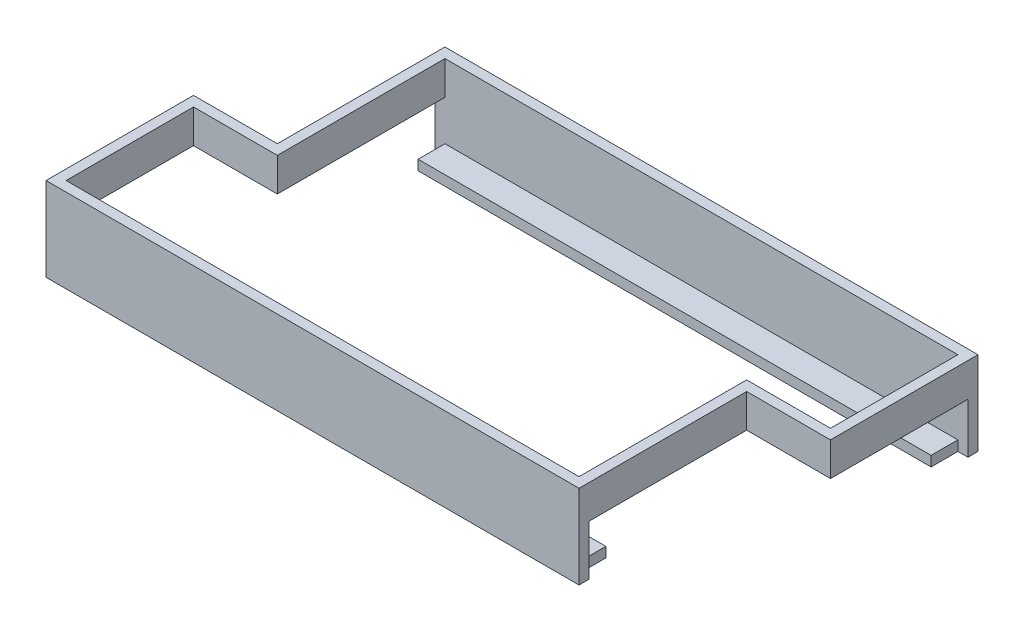
ISO-10303-21;
HEADER;
FILE_DESCRIPTION(('STEP AP214'),'2;1');
FILE_NAME('part.step','',(''),(''),'','','');
FILE_SCHEMA(('AUTOMOTIVE_DESIGN { 1 0 10303 214 1 1 1 1 }'));
ENDSEC;
DATA;
#1=APPLICATION_CONTEXT('core data for automotive mechanical design processes');
#2=APPLICATION_PROTOCOL_DEFINITION('international standard','automotive_design',2000,#1);
#3=PRODUCT_CONTEXT('',#1,'mechanical');
#4=PRODUCT('Part','Part','',(#3));
#5=PRODUCT_RELATED_PRODUCT_CATEGORY('part','',(#4));
#6=PRODUCT_DEFINITION_FORMATION('','',#4);
#7=PRODUCT_DEFINITION_CONTEXT('part definition',#1,'design');
#8=PRODUCT_DEFINITION('design','',#6,#7);
#9=PRODUCT_DEFINITION_SHAPE('','',#8);
#10=(LENGTH_UNIT() NAMED_UNIT(*) SI_UNIT(.MILLI.,.METRE.));
#11=(NAMED_UNIT(*) PLANE_ANGLE_UNIT() SI_UNIT($,.RADIAN.));
#12=(NAMED_UNIT(*) SI_UNIT($,.STERADIAN.) SOLID_ANGLE_UNIT());
#13=UNCERTAINTY_MEASURE_WITH_UNIT(LENGTH_MEASURE(1.E-05),#10,'distance_accuracy_value','');
#14=(GEOMETRIC_REPRESENTATION_CONTEXT(3) GLOBAL_UNCERTAINTY_ASSIGNED_CONTEXT((#13)) GLOBAL_UNIT_ASSIGNED_CONTEXT((#10,
#11,#12)) REPRESENTATION_CONTEXT('',''));
#15=CARTESIAN_POINT('',(0.,0.,0.));
#16=DIRECTION('',(0.,0.,1.));
#17=DIRECTION('',(1.,0.,0.));
#18=AXIS2_PLACEMENT_3D('',#15,#16,#17);
#19=CARTESIAN_POINT('',(92.,3.,-3.00000000000001));
#20=DIRECTION('',(-1.,0.,0.));
#21=DIRECTION('',(0.,0.,1.));
#22=AXIS2_PLACEMENT_3D('',#19,#20,#21);
#23=PLANE('',#22);
#24=DIRECTION('',(0.,-1.,0.));
#25=VECTOR('',#24,1.);
#26=CARTESIAN_POINT('',(92.,15.,-44.));
#27=LINE('',#26,#25);
#28=CARTESIAN_POINT('',(92.,15.,-44.));
#29=VERTEX_POINT('',#28);
#30=CARTESIAN_POINT('',(92.,0.,-44.));
#31=VERTEX_POINT('',#30);
#32=EDGE_CURVE('E281',#29,#31,#27,.T.);
#33=ORIENTED_EDGE('',*,*,#32,.T.);
#34=DIRECTION('',(0.,0.,-1.));
#35=VECTOR('',#34,1.);
#36=CARTESIAN_POINT('',(92.,0.,-3.00000000000001));
#37=LINE('',#36,#35);
#38=CARTESIAN_POINT('',(92.,0.,-47.));
#39=VERTEX_POINT('',#38);
#40=EDGE_CURVE('E404',#31,#39,#37,.T.);
#41=ORIENTED_EDGE('',*,*,#40,.T.);
#42=DIRECTION('',(0.,-1.,0.));
#43=VECTOR('',#42,1.);
#44=CARTESIAN_POINT('',(92.,3.,-47.));
#45=LINE('',#44,#43);
#46=CARTESIAN_POINT('',(92.,25.,-47.));
#47=VERTEX_POINT('',#46);
#48=EDGE_CURVE('E48',#47,#39,#45,.T.);
#49=ORIENTED_EDGE('',*,*,#48,.F.);
#50=DIRECTION('',(0.,0.,-1.));
#51=VECTOR('',#50,1.);
#52=CARTESIAN_POINT('',(92.,25.,-3.00000000000001));
#53=LINE('',#52,#51);
#54=CARTESIAN_POINT('',(92.,25.,-3.00000000000001));
#55=VERTEX_POINT('',#54);
#56=EDGE_CURVE('E383',#55,#47,#53,.T.);
#57=ORIENTED_EDGE('',*,*,#56,.F.);
#58=DIRECTION('',(0.,-1.,0.));
#59=VECTOR('',#58,1.);
#60=CARTESIAN_POINT('',(92.,3.,-3.00000000000001));
#61=LINE('',#60,#59);
#62=CARTESIAN_POINT('',(92.,15.,-3.00000000000002));
#63=VERTEX_POINT('',#62);
#64=EDGE_CURVE('E418',#55,#63,#61,.T.);
#65=ORIENTED_EDGE('',*,*,#64,.T.);
#66=DIRECTION('',(0.,0.,1.));
#67=VECTOR('',#66,1.);
#68=CARTESIAN_POINT('',(92.,15.,-44.));
#69=LINE('',#68,#67);
#70=EDGE_CURVE('E290',#29,#63,#69,.T.);
#71=ORIENTED_EDGE('',*,*,#70,.F.);
#72=EDGE_LOOP('',(#33,#41,#49,#57,#65,#71));
#73=FACE_BOUND('',#72,.T.);
#74=ADVANCED_FACE('F41',(#73),#23,.F.);
#75=CARTESIAN_POINT('',(-67.,3.,-47.));
#76=DIRECTION('',(1.,0.,0.));
#77=DIRECTION('',(0.,0.,-1.));
#78=AXIS2_PLACEMENT_3D('',#75,#76,#77);
#79=PLANE('',#78);
#80=DIRECTION('',(0.,-1.,0.));
#81=VECTOR('',#80,1.);
#82=CARTESIAN_POINT('',(-67.,3.,-44.));
#83=LINE('',#82,#81);
#84=CARTESIAN_POINT('',(-67.,15.,-44.));
#85=VERTEX_POINT('',#84);
#86=CARTESIAN_POINT('',(-67.,0.,-44.));
#87=VERTEX_POINT('',#86);
#88=EDGE_CURVE('E311',#85,#87,#83,.T.);
#89=ORIENTED_EDGE('',*,*,#88,.F.);
#90=DIRECTION('',(0.,0.,1.));
#91=VECTOR('',#90,1.);
#92=CARTESIAN_POINT('',(-67.,15.,-47.));
#93=LINE('',#92,#91);
#94=CARTESIAN_POINT('',(-67.,15.,3.00000000000001));
#95=VERTEX_POINT('',#94);
#96=EDGE_CURVE('E336',#85,#95,#93,.T.);
#97=ORIENTED_EDGE('',*,*,#96,.T.);
#98=DIRECTION('',(0.,-1.,0.));
#99=VECTOR('',#98,1.);
#100=CARTESIAN_POINT('',(-67.,3.,3.00000000000001));
#101=LINE('',#100,#99);
#102=CARTESIAN_POINT('',(-67.,25.,3.00000000000001));
#103=VERTEX_POINT('',#102);
#104=EDGE_CURVE('E433',#103,#95,#101,.T.);
#105=ORIENTED_EDGE('',*,*,#104,.F.);
#106=DIRECTION('',(0.,0.,1.));
#107=VECTOR('',#106,1.);
#108=CARTESIAN_POINT('',(-67.,25.,-47.));
#109=LINE('',#108,#107);
#110=CARTESIAN_POINT('',(-67.,25.,-47.));
#111=VERTEX_POINT('',#110);
#112=EDGE_CURVE('E389',#111,#103,#109,.T.);
#113=ORIENTED_EDGE('',*,*,#112,.F.);
#114=DIRECTION('',(0.,-1.,0.));
#115=VECTOR('',#114,1.);
#116=CARTESIAN_POINT('',(-67.,3.,-47.));
#117=LINE('',#116,#115);
#118=CARTESIAN_POINT('',(-67.,0.,-47.));
#119=VERTEX_POINT('',#118);
#120=EDGE_CURVE('E436',#111,#119,#117,.T.);
#121=ORIENTED_EDGE('',*,*,#120,.T.);
#122=DIRECTION('',(0.,0.,1.));
#123=VECTOR('',#122,1.);
#124=CARTESIAN_POINT('',(-67.,0.,-47.));
#125=LINE('',#124,#123);
#126=EDGE_CURVE('E408',#119,#87,#125,.T.);
#127=ORIENTED_EDGE('',*,*,#126,.T.);
#128=EDGE_LOOP('',(#89,#97,#105,#113,#121,#127));
#129=FACE_BOUND('',#128,.T.);
#130=ADVANCED_FACE('F467',(#129),#79,.F.);
#131=CARTESIAN_POINT('',(0.,0.,0.));
#132=DIRECTION('',(0.,-1.,0.));
#133=DIRECTION('',(0.,0.,-1.));
#134=AXIS2_PLACEMENT_3D('',#131,#132,#133);
#135=PLANE('',#134);
#136=ORIENTED_EDGE('',*,*,#40,.F.);
#137=DIRECTION('',(-1.,0.,0.));
#138=VECTOR('',#137,1.);
#139=CARTESIAN_POINT('',(0.,0.,-44.));
#140=LINE('',#139,#138);
#141=CARTESIAN_POINT('',(88.9999999999999,0.,-44.));
#142=VERTEX_POINT('',#141);
#143=EDGE_CURVE('E309',#31,#142,#140,.T.);
#144=ORIENTED_EDGE('',*,*,#143,.T.);
#145=DIRECTION('',(0.,0.,1.));
#146=VECTOR('',#145,1.);
#147=CARTESIAN_POINT('',(88.9999999999999,0.,-44.));
#148=LINE('',#147,#146);
#149=CARTESIAN_POINT('',(89.,0.,-36.));
#150=VERTEX_POINT('',#149);
#151=EDGE_CURVE('E241',#142,#150,#148,.T.);
#152=ORIENTED_EDGE('',*,*,#151,.T.);
#153=DIRECTION('',(-1.,0.,0.));
#154=VECTOR('',#153,1.);
#155=CARTESIAN_POINT('',(-64.,0.,-36.));
#156=LINE('',#155,#154);
#157=CARTESIAN_POINT('',(-64.,0.,-36.));
#158=VERTEX_POINT('',#157);
#159=EDGE_CURVE('E228',#150,#158,#156,.T.);
#160=ORIENTED_EDGE('',*,*,#159,.T.);
#161=DIRECTION('',(0.,0.,-1.));
#162=VECTOR('',#161,1.);
#163=CARTESIAN_POINT('',(-64.,0.,-44.));
#164=LINE('',#163,#162);
#165=CARTESIAN_POINT('',(-64.,0.,-44.));
#166=VERTEX_POINT('',#165);
#167=EDGE_CURVE('E55',#158,#166,#164,.T.);
#168=ORIENTED_EDGE('',*,*,#167,.T.);
#169=EDGE_CURVE('E308',#166,#87,#140,.T.);
#170=ORIENTED_EDGE('',*,*,#169,.T.);
#171=ORIENTED_EDGE('',*,*,#126,.F.);
#172=DIRECTION('',(-1.,0.,0.));
#173=VECTOR('',#172,1.);
#174=CARTESIAN_POINT('',(-67.,0.,-47.));
#175=LINE('',#174,#173);
#176=EDGE_CURVE('E406',#39,#119,#175,.T.);
#177=ORIENTED_EDGE('',*,*,#176,.F.);
#178=EDGE_LOOP('',(#136,#144,#152,#160,#168,#170,#171,#177));
#179=FACE_BOUND('',#178,.T.);
#180=ADVANCED_FACE('F245',(#179),#135,.T.);
#181=CARTESIAN_POINT('',(-67.,3.,-47.));
#182=DIRECTION('',(0.,0.,1.));
#183=DIRECTION('',(1.,0.,0.));
#184=AXIS2_PLACEMENT_3D('',#181,#182,#183);
#185=PLANE('',#184);
#186=ORIENTED_EDGE('',*,*,#176,.T.);
#187=ORIENTED_EDGE('',*,*,#120,.F.);
#188=DIRECTION('',(-1.,0.,0.));
#189=VECTOR('',#188,1.);
#190=CARTESIAN_POINT('',(92.,25.,-47.));
#191=LINE('',#190,#189);
#192=EDGE_CURVE('E386',#47,#111,#191,.T.);
#193=ORIENTED_EDGE('',*,*,#192,.F.);
#194=ORIENTED_EDGE('',*,*,#48,.T.);
#195=EDGE_LOOP('',(#186,#187,#193,#194));
#196=FACE_BOUND('',#195,.T.);
#197=ADVANCED_FACE('F441',(#196),#185,.F.);
#198=CARTESIAN_POINT('',(-67.,3.,3.00000000000001));
#199=DIRECTION('',(0.,0.,1.));
#200=DIRECTION('',(1.,0.,0.));
#201=AXIS2_PLACEMENT_3D('',#198,#199,#200);
#202=PLANE('',#201);
#203=ORIENTED_EDGE('',*,*,#104,.T.);
#204=DIRECTION('',(-1.,0.,0.));
#205=VECTOR('',#204,1.);
#206=CARTESIAN_POINT('',(-67.,15.,3.00000000000001));
#207=LINE('',#206,#205);
#208=CARTESIAN_POINT('',(-92.,15.,3.00000000000001));
#209=VERTEX_POINT('',#208);
#210=EDGE_CURVE('E333',#95,#209,#207,.T.);
#211=ORIENTED_EDGE('',*,*,#210,.T.);
#212=DIRECTION('',(0.,-1.,0.));
#213=VECTOR('',#212,1.);
#214=CARTESIAN_POINT('',(-92.,3.,3.00000000000001));
#215=LINE('',#214,#213);
#216=CARTESIAN_POINT('',(-92.,25.,3.00000000000001));
#217=VERTEX_POINT('',#216);
#218=EDGE_CURVE('E430',#217,#209,#215,.T.);
#219=ORIENTED_EDGE('',*,*,#218,.F.);
#220=DIRECTION('',(-1.,0.,0.));
#221=VECTOR('',#220,1.);
#222=CARTESIAN_POINT('',(-67.,25.,3.00000000000001));
#223=LINE('',#222,#221);
#224=EDGE_CURVE('E392',#103,#217,#223,.T.);
#225=ORIENTED_EDGE('',*,*,#224,.F.);
#226=EDGE_LOOP('',(#203,#211,#219,#225));
#227=FACE_BOUND('',#226,.T.);
#228=ADVANCED_FACE('F471',(#227),#202,.F.);
#229=CARTESIAN_POINT('',(-92.,3.,3.00000000000001));
#230=DIRECTION('',(1.,0.,0.));
#231=DIRECTION('',(0.,0.,-1.));
#232=AXIS2_PLACEMENT_3D('',#229,#230,#231);
#233=PLANE('',#232);
#234=DIRECTION('',(0.,0.,1.));
#235=VECTOR('',#234,1.);
#236=CARTESIAN_POINT('',(-92.,15.,3.00000000000002));
#237=LINE('',#236,#235);
#238=CARTESIAN_POINT('',(-92.,15.,44.));
#239=VERTEX_POINT('',#238);
#240=EDGE_CURVE('E330',#209,#239,#237,.T.);
#241=ORIENTED_EDGE('',*,*,#240,.T.);
#242=DIRECTION('',(0.,-1.,0.));
#243=VECTOR('',#242,1.);
#244=CARTESIAN_POINT('',(-92.,2.99999999999999,44.));
#245=LINE('',#244,#243);
#246=CARTESIAN_POINT('',(-92.,0.,44.));
#247=VERTEX_POINT('',#246);
#248=EDGE_CURVE('E305',#239,#247,#245,.T.);
#249=ORIENTED_EDGE('',*,*,#248,.T.);
#250=DIRECTION('',(0.,0.,1.));
#251=VECTOR('',#250,1.);
#252=CARTESIAN_POINT('',(-92.,0.,3.00000000000001));
#253=LINE('',#252,#251);
#254=CARTESIAN_POINT('',(-92.,0.,47.));
#255=VERTEX_POINT('',#254);
#256=EDGE_CURVE('E411',#247,#255,#253,.T.);
#257=ORIENTED_EDGE('',*,*,#256,.T.);
#258=DIRECTION('',(0.,-1.,0.));
#259=VECTOR('',#258,1.);
#260=CARTESIAN_POINT('',(-92.,3.,47.));
#261=LINE('',#260,#259);
#262=CARTESIAN_POINT('',(-92.,25.,47.));
#263=VERTEX_POINT('',#262);
#264=EDGE_CURVE('E427',#263,#255,#261,.T.);
#265=ORIENTED_EDGE('',*,*,#264,.F.);
#266=DIRECTION('',(0.,0.,1.));
#267=VECTOR('',#266,1.);
#268=CARTESIAN_POINT('',(-92.,25.,3.00000000000001));
#269=LINE('',#268,#267);
#270=EDGE_CURVE('E395',#217,#263,#269,.T.);
#271=ORIENTED_EDGE('',*,*,#270,.F.);
#272=ORIENTED_EDGE('',*,*,#218,.T.);
#273=EDGE_LOOP('',(#241,#249,#257,#265,#271,#272));
#274=FACE_BOUND('',#273,.T.);
#275=ADVANCED_FACE('F473',(#274),#233,.F.);
#276=CARTESIAN_POINT('',(-67.,3.,47.));
#277=DIRECTION('',(0.,0.,-1.));
#278=DIRECTION('',(-1.,0.,0.));
#279=AXIS2_PLACEMENT_3D('',#276,#277,#278);
#280=PLANE('',#279);
#281=DIRECTION('',(1.,0.,0.));
#282=VECTOR('',#281,1.);
#283=CARTESIAN_POINT('',(-67.,0.,47.));
#284=LINE('',#283,#282);
#285=CARTESIAN_POINT('',(67.,0.,47.));
#286=VERTEX_POINT('',#285);
#287=EDGE_CURVE('E413',#255,#286,#284,.T.);
#288=ORIENTED_EDGE('',*,*,#287,.T.);
#289=DIRECTION('',(0.,-1.,0.));
#290=VECTOR('',#289,1.);
#291=CARTESIAN_POINT('',(67.,3.,47.));
#292=LINE('',#291,#290);
#293=CARTESIAN_POINT('',(67.,25.,47.));
#294=VERTEX_POINT('',#293);
#295=EDGE_CURVE('E424',#294,#286,#292,.T.);
#296=ORIENTED_EDGE('',*,*,#295,.F.);
#297=DIRECTION('',(1.,0.,0.));
#298=VECTOR('',#297,1.);
#299=CARTESIAN_POINT('',(-92.,25.,47.));
#300=LINE('',#299,#298);
#301=EDGE_CURVE('E398',#263,#294,#300,.T.);
#302=ORIENTED_EDGE('',*,*,#301,.F.);
#303=ORIENTED_EDGE('',*,*,#264,.T.);
#304=EDGE_LOOP('',(#288,#296,#302,#303));
#305=FACE_BOUND('',#304,.T.);
#306=ADVANCED_FACE('F476',(#305),#280,.F.);
#307=CARTESIAN_POINT('',(67.,3.,-3.00000000000001));
#308=DIRECTION('',(-1.,0.,0.));
#309=DIRECTION('',(0.,0.,1.));
#310=AXIS2_PLACEMENT_3D('',#307,#308,#309);
#311=PLANE('',#310);
#312=DIRECTION('',(0.,0.,-1.));
#313=VECTOR('',#312,1.);
#314=CARTESIAN_POINT('',(67.,0.,-3.00000000000001));
#315=LINE('',#314,#313);
#316=CARTESIAN_POINT('',(67.,0.,44.));
#317=VERTEX_POINT('',#316);
#318=EDGE_CURVE('E415',#286,#317,#315,.T.);
#319=ORIENTED_EDGE('',*,*,#318,.T.);
#320=DIRECTION('',(0.,1.,0.));
#321=VECTOR('',#320,1.);
#322=CARTESIAN_POINT('',(67.,2.99999999999998,44.));
#323=LINE('',#322,#321);
#324=CARTESIAN_POINT('',(66.9999999999999,15.,44.));
#325=VERTEX_POINT('',#324);
#326=EDGE_CURVE('E301',#317,#325,#323,.T.);
#327=ORIENTED_EDGE('',*,*,#326,.T.);
#328=DIRECTION('',(0.,0.,-1.));
#329=VECTOR('',#328,1.);
#330=CARTESIAN_POINT('',(67.,15.,-3.00000000000001));
#331=LINE('',#330,#329);
#332=CARTESIAN_POINT('',(67.,15.,-3.00000000000001));
#333=VERTEX_POINT('',#332);
#334=EDGE_CURVE('E327',#325,#333,#331,.T.);
#335=ORIENTED_EDGE('',*,*,#334,.T.);
#336=DIRECTION('',(0.,-1.,0.));
#337=VECTOR('',#336,1.);
#338=CARTESIAN_POINT('',(67.,3.,-3.00000000000001));
#339=LINE('',#338,#337);
#340=CARTESIAN_POINT('',(67.,25.,-3.00000000000001));
#341=VERTEX_POINT('',#340);
#342=EDGE_CURVE('E421',#341,#333,#339,.T.);
#343=ORIENTED_EDGE('',*,*,#342,.F.);
#344=DIRECTION('',(0.,0.,-1.));
#345=VECTOR('',#344,1.);
#346=CARTESIAN_POINT('',(67.,25.,47.));
#347=LINE('',#346,#345);
#348=EDGE_CURVE('E401',#294,#341,#347,.T.);
#349=ORIENTED_EDGE('',*,*,#348,.F.);
#350=ORIENTED_EDGE('',*,*,#295,.T.);
#351=EDGE_LOOP('',(#319,#327,#335,#343,#349,#350));
#352=FACE_BOUND('',#351,.T.);
#353=ADVANCED_FACE('F480',(#352),#311,.F.);
#354=CARTESIAN_POINT('',(92.,3.,-3.00000000000001));
#355=DIRECTION('',(0.,0.,-1.));
#356=DIRECTION('',(-1.,0.,0.));
#357=AXIS2_PLACEMENT_3D('',#354,#355,#356);
#358=PLANE('',#357);
#359=ORIENTED_EDGE('',*,*,#342,.T.);
#360=DIRECTION('',(1.,0.,0.));
#361=VECTOR('',#360,1.);
#362=CARTESIAN_POINT('',(92.,15.,-3.00000000000001));
#363=LINE('',#362,#361);
#364=EDGE_CURVE('E324',#333,#63,#363,.T.);
#365=ORIENTED_EDGE('',*,*,#364,.T.);
#366=ORIENTED_EDGE('',*,*,#64,.F.);
#367=DIRECTION('',(1.,0.,0.));
#368=VECTOR('',#367,1.);
#369=CARTESIAN_POINT('',(67.,25.,-3.00000000000001));
#370=LINE('',#369,#368);
#371=EDGE_CURVE('E380',#341,#55,#370,.T.);
#372=ORIENTED_EDGE('',*,*,#371,.F.);
#373=EDGE_LOOP('',(#359,#365,#366,#372));
#374=FACE_BOUND('',#373,.T.);
#375=ADVANCED_FACE('F452',(#374),#358,.F.);
#376=DIRECTION('',(-1.,0.,0.));
#377=VECTOR('',#376,1.);
#378=CARTESIAN_POINT('',(0.,0.,44.));
#379=LINE('',#378,#377);
#380=CARTESIAN_POINT('',(63.9999999999999,0.,44.));
#381=VERTEX_POINT('',#380);
#382=EDGE_CURVE('E299',#317,#381,#379,.T.);
#383=ORIENTED_EDGE('',*,*,#382,.F.);
#384=ORIENTED_EDGE('',*,*,#318,.F.);
#385=ORIENTED_EDGE('',*,*,#287,.F.);
#386=ORIENTED_EDGE('',*,*,#256,.F.);
#387=CARTESIAN_POINT('',(-89.,0.,44.));
#388=VERTEX_POINT('',#387);
#389=EDGE_CURVE('E302',#388,#247,#379,.T.);
#390=ORIENTED_EDGE('',*,*,#389,.F.);
#391=DIRECTION('',(0.,0.,-1.));
#392=VECTOR('',#391,1.);
#393=CARTESIAN_POINT('',(-89.,0.,44.));
#394=LINE('',#393,#392);
#395=CARTESIAN_POINT('',(-89.,0.,36.));
#396=VERTEX_POINT('',#395);
#397=EDGE_CURVE('E240',#388,#396,#394,.T.);
#398=ORIENTED_EDGE('',*,*,#397,.T.);
#399=DIRECTION('',(1.,0.,0.));
#400=VECTOR('',#399,1.);
#401=CARTESIAN_POINT('',(-89.,0.,36.));
#402=LINE('',#401,#400);
#403=CARTESIAN_POINT('',(63.9999999999999,0.,36.));
#404=VERTEX_POINT('',#403);
#405=EDGE_CURVE('E274',#396,#404,#402,.T.);
#406=ORIENTED_EDGE('',*,*,#405,.T.);
#407=DIRECTION('',(0.,0.,1.));
#408=VECTOR('',#407,1.);
#409=CARTESIAN_POINT('',(63.9999999999999,0.,44.));
#410=LINE('',#409,#408);
#411=EDGE_CURVE('E264',#404,#381,#410,.T.);
#412=ORIENTED_EDGE('',*,*,#411,.T.);
#413=EDGE_LOOP('',(#383,#384,#385,#386,#390,#398,#406,#412));
#414=FACE_BOUND('',#413,.T.);
#415=ADVANCED_FACE('F483',(#414),#135,.T.);
#416=CARTESIAN_POINT('',(0.,25.,0.));
#417=DIRECTION('',(0.,1.,0.));
#418=DIRECTION('',(0.,0.,1.));
#419=AXIS2_PLACEMENT_3D('',#416,#417,#418);
#420=PLANE('',#419);
#421=ORIENTED_EDGE('',*,*,#371,.T.);
#422=ORIENTED_EDGE('',*,*,#56,.T.);
#423=ORIENTED_EDGE('',*,*,#192,.T.);
#424=ORIENTED_EDGE('',*,*,#112,.T.);
#425=ORIENTED_EDGE('',*,*,#224,.T.);
#426=ORIENTED_EDGE('',*,*,#270,.T.);
#427=ORIENTED_EDGE('',*,*,#301,.T.);
#428=ORIENTED_EDGE('',*,*,#348,.T.);
#429=EDGE_LOOP('',(#421,#422,#423,#424,#425,#426,#427,#428));
#430=FACE_BOUND('',#429,.T.);
#431=DIRECTION('',(0.,0.,1.));
#432=VECTOR('',#431,1.);
#433=CARTESIAN_POINT('',(-64.,25.,-44.));
#434=LINE('',#433,#432);
#435=CARTESIAN_POINT('',(-64.,25.,-44.));
#436=VERTEX_POINT('',#435);
#437=CARTESIAN_POINT('',(-64.,25.,6.00000000000001));
#438=VERTEX_POINT('',#437);
#439=EDGE_CURVE('E341',#436,#438,#434,.T.);
#440=ORIENTED_EDGE('',*,*,#439,.F.);
#441=DIRECTION('',(-1.,0.,0.));
#442=VECTOR('',#441,1.);
#443=CARTESIAN_POINT('',(89.,25.,-44.));
#444=LINE('',#443,#442);
#445=CARTESIAN_POINT('',(89.,25.,-44.));
#446=VERTEX_POINT('',#445);
#447=EDGE_CURVE('E339',#446,#436,#444,.T.);
#448=ORIENTED_EDGE('',*,*,#447,.F.);
#449=DIRECTION('',(0.,0.,-1.));
#450=VECTOR('',#449,1.);
#451=CARTESIAN_POINT('',(89.,25.,-6.00000000000001));
#452=LINE('',#451,#450);
#453=CARTESIAN_POINT('',(89.,25.,-6.00000000000001));
#454=VERTEX_POINT('',#453);
#455=EDGE_CURVE('E354',#454,#446,#452,.T.);
#456=ORIENTED_EDGE('',*,*,#455,.F.);
#457=DIRECTION('',(1.,0.,0.));
#458=VECTOR('',#457,1.);
#459=CARTESIAN_POINT('',(64.,25.,-6.00000000000001));
#460=LINE('',#459,#458);
#461=CARTESIAN_POINT('',(64.,25.,-6.00000000000001));
#462=VERTEX_POINT('',#461);
#463=EDGE_CURVE('E351',#462,#454,#460,.T.);
#464=ORIENTED_EDGE('',*,*,#463,.F.);
#465=DIRECTION('',(0.,0.,-1.));
#466=VECTOR('',#465,1.);
#467=CARTESIAN_POINT('',(64.,25.,44.));
#468=LINE('',#467,#466);
#469=CARTESIAN_POINT('',(64.,25.,44.));
#470=VERTEX_POINT('',#469);
#471=EDGE_CURVE('E349',#470,#462,#468,.T.);
#472=ORIENTED_EDGE('',*,*,#471,.F.);
#473=DIRECTION('',(1.,0.,0.));
#474=VECTOR('',#473,1.);
#475=CARTESIAN_POINT('',(-89.,25.,44.));
#476=LINE('',#475,#474);
#477=CARTESIAN_POINT('',(-89.,25.,44.));
#478=VERTEX_POINT('',#477);
#479=EDGE_CURVE('E347',#478,#470,#476,.T.);
#480=ORIENTED_EDGE('',*,*,#479,.F.);
#481=DIRECTION('',(0.,0.,1.));
#482=VECTOR('',#481,1.);
#483=CARTESIAN_POINT('',(-89.,25.,6.00000000000001));
#484=LINE('',#483,#482);
#485=CARTESIAN_POINT('',(-89.,25.,6.00000000000001));
#486=VERTEX_POINT('',#485);
#487=EDGE_CURVE('E345',#486,#478,#484,.T.);
#488=ORIENTED_EDGE('',*,*,#487,.F.);
#489=DIRECTION('',(-1.,0.,0.));
#490=VECTOR('',#489,1.);
#491=CARTESIAN_POINT('',(-64.,25.,6.00000000000001));
#492=LINE('',#491,#490);
#493=EDGE_CURVE('E343',#438,#486,#492,.T.);
#494=ORIENTED_EDGE('',*,*,#493,.F.);
#495=EDGE_LOOP('',(#440,#448,#456,#464,#472,#480,#488,#494));
#496=FACE_BOUND('',#495,.T.);
#497=ADVANCED_FACE('F446',(#430,#496),#420,.T.);
#498=CARTESIAN_POINT('',(89.,25.,-44.));
#499=DIRECTION('',(0.,0.,1.));
#500=DIRECTION('',(1.,0.,0.));
#501=AXIS2_PLACEMENT_3D('',#498,#499,#500);
#502=PLANE('',#501);
#503=DIRECTION('',(0.,-1.,0.));
#504=VECTOR('',#503,1.);
#505=CARTESIAN_POINT('',(-64.,3.,-44.));
#506=LINE('',#505,#504);
#507=CARTESIAN_POINT('',(-64.,3.,-44.));
#508=VERTEX_POINT('',#507);
#509=EDGE_CURVE('E238',#508,#166,#506,.T.);
#510=ORIENTED_EDGE('',*,*,#509,.F.);
#511=DIRECTION('',(1.,0.,0.));
#512=VECTOR('',#511,1.);
#513=CARTESIAN_POINT('',(-64.,3.,-44.));
#514=LINE('',#513,#512);
#515=CARTESIAN_POINT('',(88.9999999999999,3.,-44.));
#516=VERTEX_POINT('',#515);
#517=EDGE_CURVE('E250',#508,#516,#514,.T.);
#518=ORIENTED_EDGE('',*,*,#517,.T.);
#519=DIRECTION('',(0.,-1.,0.));
#520=VECTOR('',#519,1.);
#521=CARTESIAN_POINT('',(88.9999999999999,3.,-44.));
#522=LINE('',#521,#520);
#523=EDGE_CURVE('E463',#516,#142,#522,.T.);
#524=ORIENTED_EDGE('',*,*,#523,.T.);
#525=ORIENTED_EDGE('',*,*,#143,.F.);
#526=ORIENTED_EDGE('',*,*,#32,.F.);
#527=DIRECTION('',(1.,0.,0.));
#528=VECTOR('',#527,1.);
#529=CARTESIAN_POINT('',(-116.,15.,-44.));
#530=LINE('',#529,#528);
#531=CARTESIAN_POINT('',(88.9999999999999,15.,-44.));
#532=VERTEX_POINT('',#531);
#533=EDGE_CURVE('E292',#532,#29,#530,.T.);
#534=ORIENTED_EDGE('',*,*,#533,.F.);
#535=DIRECTION('',(0.,-1.,0.));
#536=VECTOR('',#535,1.);
#537=CARTESIAN_POINT('',(89.,25.,-44.));
#538=LINE('',#537,#536);
#539=EDGE_CURVE('E356',#446,#532,#538,.T.);
#540=ORIENTED_EDGE('',*,*,#539,.F.);
#541=ORIENTED_EDGE('',*,*,#447,.T.);
#542=DIRECTION('',(0.,-1.,0.));
#543=VECTOR('',#542,1.);
#544=CARTESIAN_POINT('',(-64.,25.,-44.));
#545=LINE('',#544,#543);
#546=CARTESIAN_POINT('',(-64.,15.,-44.));
#547=VERTEX_POINT('',#546);
#548=EDGE_CURVE('E377',#436,#547,#545,.T.);
#549=ORIENTED_EDGE('',*,*,#548,.T.);
#550=EDGE_CURVE('E294',#85,#547,#530,.T.);
#551=ORIENTED_EDGE('',*,*,#550,.F.);
#552=ORIENTED_EDGE('',*,*,#88,.T.);
#553=ORIENTED_EDGE('',*,*,#169,.F.);
#554=EDGE_LOOP('',(#510,#518,#524,#525,#526,#534,#540,#541,#549,#551,#552,#553));
#555=FACE_BOUND('',#554,.T.);
#556=ADVANCED_FACE('F461',(#555),#502,.T.);
#557=CARTESIAN_POINT('',(-64.,25.,-44.));
#558=DIRECTION('',(1.,0.,0.));
#559=DIRECTION('',(0.,0.,-1.));
#560=AXIS2_PLACEMENT_3D('',#557,#558,#559);
#561=PLANE('',#560);
#562=DIRECTION('',(0.,0.,1.));
#563=VECTOR('',#562,1.);
#564=CARTESIAN_POINT('',(-64.,15.,-44.));
#565=LINE('',#564,#563);
#566=CARTESIAN_POINT('',(-64.,15.,6.00000000000001));
#567=VERTEX_POINT('',#566);
#568=EDGE_CURVE('E322',#547,#567,#565,.T.);
#569=ORIENTED_EDGE('',*,*,#568,.F.);
#570=ORIENTED_EDGE('',*,*,#548,.F.);
#571=ORIENTED_EDGE('',*,*,#439,.T.);
#572=DIRECTION('',(0.,-1.,0.));
#573=VECTOR('',#572,1.);
#574=CARTESIAN_POINT('',(-64.,25.,6.00000000000001));
#575=LINE('',#574,#573);
#576=EDGE_CURVE('E374',#438,#567,#575,.T.);
#577=ORIENTED_EDGE('',*,*,#576,.T.);
#578=EDGE_LOOP('',(#569,#570,#571,#577));
#579=FACE_BOUND('',#578,.T.);
#580=ADVANCED_FACE('F528',(#579),#561,.T.);
#581=CARTESIAN_POINT('',(-64.,25.,6.00000000000001));
#582=DIRECTION('',(0.,0.,1.));
#583=DIRECTION('',(1.,0.,0.));
#584=AXIS2_PLACEMENT_3D('',#581,#582,#583);
#585=PLANE('',#584);
#586=DIRECTION('',(-1.,0.,0.));
#587=VECTOR('',#586,1.);
#588=CARTESIAN_POINT('',(-64.,15.,6.00000000000001));
#589=LINE('',#588,#587);
#590=CARTESIAN_POINT('',(-89.,15.,6.00000000000001));
#591=VERTEX_POINT('',#590);
#592=EDGE_CURVE('E320',#567,#591,#589,.T.);
#593=ORIENTED_EDGE('',*,*,#592,.F.);
#594=ORIENTED_EDGE('',*,*,#576,.F.);
#595=ORIENTED_EDGE('',*,*,#493,.T.);
#596=DIRECTION('',(0.,-1.,0.));
#597=VECTOR('',#596,1.);
#598=CARTESIAN_POINT('',(-89.,25.,6.00000000000001));
#599=LINE('',#598,#597);
#600=EDGE_CURVE('E371',#486,#591,#599,.T.);
#601=ORIENTED_EDGE('',*,*,#600,.T.);
#602=EDGE_LOOP('',(#593,#594,#595,#601));
#603=FACE_BOUND('',#602,.T.);
#604=ADVANCED_FACE('F531',(#603),#585,.T.);
#605=CARTESIAN_POINT('',(-89.,25.,6.00000000000001));
#606=DIRECTION('',(1.,0.,0.));
#607=DIRECTION('',(0.,0.,-1.));
#608=AXIS2_PLACEMENT_3D('',#605,#606,#607);
#609=PLANE('',#608);
#610=DIRECTION('',(0.,0.,1.));
#611=VECTOR('',#610,1.);
#612=CARTESIAN_POINT('',(-89.,15.,6.00000000000001));
#613=LINE('',#612,#611);
#614=CARTESIAN_POINT('',(-89.,15.,44.));
#615=VERTEX_POINT('',#614);
#616=EDGE_CURVE('E318',#591,#615,#613,.T.);
#617=ORIENTED_EDGE('',*,*,#616,.F.);
#618=ORIENTED_EDGE('',*,*,#600,.F.);
#619=ORIENTED_EDGE('',*,*,#487,.T.);
#620=DIRECTION('',(0.,-1.,0.));
#621=VECTOR('',#620,1.);
#622=CARTESIAN_POINT('',(-89.,25.,44.));
#623=LINE('',#622,#621);
#624=EDGE_CURVE('E368',#478,#615,#623,.T.);
#625=ORIENTED_EDGE('',*,*,#624,.T.);
#626=EDGE_LOOP('',(#617,#618,#619,#625));
#627=FACE_BOUND('',#626,.T.);
#628=ADVANCED_FACE('F505',(#627),#609,.T.);
#629=CARTESIAN_POINT('',(-89.,25.,44.));
#630=DIRECTION('',(0.,0.,-1.));
#631=DIRECTION('',(-1.,0.,0.));
#632=AXIS2_PLACEMENT_3D('',#629,#630,#631);
#633=PLANE('',#632);
#634=DIRECTION('',(0.,-1.,0.));
#635=VECTOR('',#634,1.);
#636=CARTESIAN_POINT('',(-89.,3.,44.));
#637=LINE('',#636,#635);
#638=CARTESIAN_POINT('',(-89.,3.,44.));
#639=VERTEX_POINT('',#638);
#640=EDGE_CURVE('E279',#639,#388,#637,.T.);
#641=ORIENTED_EDGE('',*,*,#640,.T.);
#642=ORIENTED_EDGE('',*,*,#389,.T.);
#643=ORIENTED_EDGE('',*,*,#248,.F.);
#644=DIRECTION('',(1.,0.,0.));
#645=VECTOR('',#644,1.);
#646=CARTESIAN_POINT('',(-116.,15.,44.));
#647=LINE('',#646,#645);
#648=EDGE_CURVE('E298',#239,#615,#647,.T.);
#649=ORIENTED_EDGE('',*,*,#648,.T.);
#650=ORIENTED_EDGE('',*,*,#624,.F.);
#651=ORIENTED_EDGE('',*,*,#479,.T.);
#652=DIRECTION('',(0.,-1.,0.));
#653=VECTOR('',#652,1.);
#654=CARTESIAN_POINT('',(64.,25.,44.));
#655=LINE('',#654,#653);
#656=CARTESIAN_POINT('',(63.9999999999999,15.,44.));
#657=VERTEX_POINT('',#656);
#658=EDGE_CURVE('E365',#470,#657,#655,.T.);
#659=ORIENTED_EDGE('',*,*,#658,.T.);
#660=EDGE_CURVE('E295',#657,#325,#647,.T.);
#661=ORIENTED_EDGE('',*,*,#660,.T.);
#662=ORIENTED_EDGE('',*,*,#326,.F.);
#663=ORIENTED_EDGE('',*,*,#382,.T.);
#664=DIRECTION('',(0.,-1.,0.));
#665=VECTOR('',#664,1.);
#666=CARTESIAN_POINT('',(63.9999999999999,3.,44.));
#667=LINE('',#666,#665);
#668=CARTESIAN_POINT('',(63.9999999999999,3.,44.));
#669=VERTEX_POINT('',#668);
#670=EDGE_CURVE('E282',#669,#381,#667,.T.);
#671=ORIENTED_EDGE('',*,*,#670,.F.);
#672=DIRECTION('',(-1.,0.,0.));
#673=VECTOR('',#672,1.);
#674=CARTESIAN_POINT('',(-89.,3.,44.));
#675=LINE('',#674,#673);
#676=EDGE_CURVE('E63',#669,#639,#675,.T.);
#677=ORIENTED_EDGE('',*,*,#676,.T.);
#678=EDGE_LOOP('',(#641,#642,#643,#649,#650,#651,#659,#661,#662,#663,#671,#677));
#679=FACE_BOUND('',#678,.T.);
#680=ADVANCED_FACE('F486',(#679),#633,.T.);
#681=CARTESIAN_POINT('',(64.,25.,44.));
#682=DIRECTION('',(-1.,0.,0.));
#683=DIRECTION('',(0.,0.,1.));
#684=AXIS2_PLACEMENT_3D('',#681,#682,#683);
#685=PLANE('',#684);
#686=DIRECTION('',(0.,0.,-1.));
#687=VECTOR('',#686,1.);
#688=CARTESIAN_POINT('',(64.,15.,44.));
#689=LINE('',#688,#687);
#690=CARTESIAN_POINT('',(64.,15.,-6.00000000000001));
#691=VERTEX_POINT('',#690);
#692=EDGE_CURVE('E316',#657,#691,#689,.T.);
#693=ORIENTED_EDGE('',*,*,#692,.F.);
#694=ORIENTED_EDGE('',*,*,#658,.F.);
#695=ORIENTED_EDGE('',*,*,#471,.T.);
#696=DIRECTION('',(0.,-1.,0.));
#697=VECTOR('',#696,1.);
#698=CARTESIAN_POINT('',(64.,25.,-6.00000000000001));
#699=LINE('',#698,#697);
#700=EDGE_CURVE('E362',#462,#691,#699,.T.);
#701=ORIENTED_EDGE('',*,*,#700,.T.);
#702=EDGE_LOOP('',(#693,#694,#695,#701));
#703=FACE_BOUND('',#702,.T.);
#704=ADVANCED_FACE('F515',(#703),#685,.T.);
#705=CARTESIAN_POINT('',(64.,25.,-6.00000000000001));
#706=DIRECTION('',(0.,0.,-1.));
#707=DIRECTION('',(-1.,0.,0.));
#708=AXIS2_PLACEMENT_3D('',#705,#706,#707);
#709=PLANE('',#708);
#710=DIRECTION('',(1.,0.,0.));
#711=VECTOR('',#710,1.);
#712=CARTESIAN_POINT('',(64.,15.,-6.00000000000001));
#713=LINE('',#712,#711);
#714=CARTESIAN_POINT('',(89.,15.,-6.00000000000001));
#715=VERTEX_POINT('',#714);
#716=EDGE_CURVE('E314',#691,#715,#713,.T.);
#717=ORIENTED_EDGE('',*,*,#716,.F.);
#718=ORIENTED_EDGE('',*,*,#700,.F.);
#719=ORIENTED_EDGE('',*,*,#463,.T.);
#720=DIRECTION('',(0.,-1.,0.));
#721=VECTOR('',#720,1.);
#722=CARTESIAN_POINT('',(89.,25.,-6.00000000000001));
#723=LINE('',#722,#721);
#724=EDGE_CURVE('E359',#454,#715,#723,.T.);
#725=ORIENTED_EDGE('',*,*,#724,.T.);
#726=EDGE_LOOP('',(#717,#718,#719,#725));
#727=FACE_BOUND('',#726,.T.);
#728=ADVANCED_FACE('F519',(#727),#709,.T.);
#729=CARTESIAN_POINT('',(89.,25.,-6.00000000000001));
#730=DIRECTION('',(-1.,0.,0.));
#731=DIRECTION('',(0.,0.,1.));
#732=AXIS2_PLACEMENT_3D('',#729,#730,#731);
#733=PLANE('',#732);
#734=DIRECTION('',(0.,0.,-1.));
#735=VECTOR('',#734,1.);
#736=CARTESIAN_POINT('',(89.,15.,-6.00000000000001));
#737=LINE('',#736,#735);
#738=EDGE_CURVE('E11',#715,#532,#737,.T.);
#739=ORIENTED_EDGE('',*,*,#738,.F.);
#740=ORIENTED_EDGE('',*,*,#724,.F.);
#741=ORIENTED_EDGE('',*,*,#455,.T.);
#742=ORIENTED_EDGE('',*,*,#539,.T.);
#743=EDGE_LOOP('',(#739,#740,#741,#742));
#744=FACE_BOUND('',#743,.T.);
#745=ADVANCED_FACE('F522',(#744),#733,.T.);
#746=CARTESIAN_POINT('',(-116.,15.,-44.));
#747=DIRECTION('',(0.,1.,0.));
#748=DIRECTION('',(0.,0.,1.));
#749=AXIS2_PLACEMENT_3D('',#746,#747,#748);
#750=PLANE('',#749);
#751=ORIENTED_EDGE('',*,*,#550,.T.);
#752=ORIENTED_EDGE('',*,*,#568,.T.);
#753=ORIENTED_EDGE('',*,*,#592,.T.);
#754=ORIENTED_EDGE('',*,*,#616,.T.);
#755=ORIENTED_EDGE('',*,*,#648,.F.);
#756=ORIENTED_EDGE('',*,*,#240,.F.);
#757=ORIENTED_EDGE('',*,*,#210,.F.);
#758=ORIENTED_EDGE('',*,*,#96,.F.);
#759=EDGE_LOOP('',(#751,#752,#753,#754,#755,#756,#757,#758));
#760=FACE_BOUND('',#759,.T.);
#761=ADVANCED_FACE('F532',(#760),#750,.F.);
#762=ORIENTED_EDGE('',*,*,#660,.F.);
#763=ORIENTED_EDGE('',*,*,#692,.T.);
#764=ORIENTED_EDGE('',*,*,#716,.T.);
#765=ORIENTED_EDGE('',*,*,#738,.T.);
#766=ORIENTED_EDGE('',*,*,#533,.T.);
#767=ORIENTED_EDGE('',*,*,#70,.T.);
#768=ORIENTED_EDGE('',*,*,#364,.F.);
#769=ORIENTED_EDGE('',*,*,#334,.F.);
#770=EDGE_LOOP('',(#762,#763,#764,#765,#766,#767,#768,#769));
#771=FACE_BOUND('',#770,.T.);
#772=ADVANCED_FACE('F456',(#771),#750,.F.);
#773=CARTESIAN_POINT('',(-89.,3.,44.));
#774=DIRECTION('',(-1.,0.,0.));
#775=DIRECTION('',(0.,0.,1.));
#776=AXIS2_PLACEMENT_3D('',#773,#774,#775);
#777=PLANE('',#776);
#778=ORIENTED_EDGE('',*,*,#397,.F.);
#779=ORIENTED_EDGE('',*,*,#640,.F.);
#780=DIRECTION('',(0.,0.,-1.));
#781=VECTOR('',#780,1.);
#782=CARTESIAN_POINT('',(-89.,3.,44.));
#783=LINE('',#782,#781);
#784=CARTESIAN_POINT('',(-89.,3.,36.));
#785=VERTEX_POINT('',#784);
#786=EDGE_CURVE('E260',#639,#785,#783,.T.);
#787=ORIENTED_EDGE('',*,*,#786,.T.);
#788=DIRECTION('',(0.,-1.,0.));
#789=VECTOR('',#788,1.);
#790=CARTESIAN_POINT('',(-89.,3.,36.));
#791=LINE('',#790,#789);
#792=EDGE_CURVE('E271',#785,#396,#791,.T.);
#793=ORIENTED_EDGE('',*,*,#792,.T.);
#794=EDGE_LOOP('',(#778,#779,#787,#793));
#795=FACE_BOUND('',#794,.T.);
#796=ADVANCED_FACE('F496',(#795),#777,.T.);
#797=CARTESIAN_POINT('',(63.9999999999999,3.,44.));
#798=DIRECTION('',(1.,0.,0.));
#799=DIRECTION('',(0.,0.,-1.));
#800=AXIS2_PLACEMENT_3D('',#797,#798,#799);
#801=PLANE('',#800);
#802=ORIENTED_EDGE('',*,*,#411,.F.);
#803=DIRECTION('',(0.,-1.,0.));
#804=VECTOR('',#803,1.);
#805=CARTESIAN_POINT('',(63.9999999999999,3.,36.));
#806=LINE('',#805,#804);
#807=CARTESIAN_POINT('',(63.9999999999999,3.,36.));
#808=VERTEX_POINT('',#807);
#809=EDGE_CURVE('E285',#808,#404,#806,.T.);
#810=ORIENTED_EDGE('',*,*,#809,.F.);
#811=DIRECTION('',(0.,0.,1.));
#812=VECTOR('',#811,1.);
#813=CARTESIAN_POINT('',(63.9999999999999,3.,44.));
#814=LINE('',#813,#812);
#815=EDGE_CURVE('E267',#808,#669,#814,.T.);
#816=ORIENTED_EDGE('',*,*,#815,.T.);
#817=ORIENTED_EDGE('',*,*,#670,.T.);
#818=EDGE_LOOP('',(#802,#810,#816,#817));
#819=FACE_BOUND('',#818,.T.);
#820=ADVANCED_FACE('F488',(#819),#801,.T.);
#821=CARTESIAN_POINT('',(-89.,3.,36.));
#822=DIRECTION('',(0.,0.,-1.));
#823=DIRECTION('',(-1.,0.,0.));
#824=AXIS2_PLACEMENT_3D('',#821,#822,#823);
#825=PLANE('',#824);
#826=ORIENTED_EDGE('',*,*,#405,.F.);
#827=ORIENTED_EDGE('',*,*,#792,.F.);
#828=DIRECTION('',(1.,0.,0.));
#829=VECTOR('',#828,1.);
#830=CARTESIAN_POINT('',(-89.,3.,36.));
#831=LINE('',#830,#829);
#832=EDGE_CURVE('E263',#785,#808,#831,.T.);
#833=ORIENTED_EDGE('',*,*,#832,.T.);
#834=ORIENTED_EDGE('',*,*,#809,.T.);
#835=EDGE_LOOP('',(#826,#827,#833,#834));
#836=FACE_BOUND('',#835,.T.);
#837=ADVANCED_FACE('F599',(#836),#825,.T.);
#838=CARTESIAN_POINT('',(0.,3.,0.));
#839=DIRECTION('',(0.,-1.,0.));
#840=DIRECTION('',(0.,0.,-1.));
#841=AXIS2_PLACEMENT_3D('',#838,#839,#840);
#842=PLANE('',#841);
#843=ORIENTED_EDGE('',*,*,#786,.F.);
#844=ORIENTED_EDGE('',*,*,#676,.F.);
#845=ORIENTED_EDGE('',*,*,#815,.F.);
#846=ORIENTED_EDGE('',*,*,#832,.F.);
#847=EDGE_LOOP('',(#843,#844,#845,#846));
#848=FACE_BOUND('',#847,.T.);
#849=ADVANCED_FACE('F493',(#848),#842,.F.);
#850=CARTESIAN_POINT('',(-64.,3.,-44.));
#851=DIRECTION('',(-1.,0.,0.));
#852=DIRECTION('',(0.,0.,1.));
#853=AXIS2_PLACEMENT_3D('',#850,#851,#852);
#854=PLANE('',#853);
#855=ORIENTED_EDGE('',*,*,#167,.F.);
#856=DIRECTION('',(0.,-1.,0.));
#857=VECTOR('',#856,1.);
#858=CARTESIAN_POINT('',(-64.,3.,-36.));
#859=LINE('',#858,#857);
#860=CARTESIAN_POINT('',(-64.,3.,-36.));
#861=VERTEX_POINT('',#860);
#862=EDGE_CURVE('E226',#861,#158,#859,.T.);
#863=ORIENTED_EDGE('',*,*,#862,.F.);
#864=DIRECTION('',(0.,0.,-1.));
#865=VECTOR('',#864,1.);
#866=CARTESIAN_POINT('',(-64.,3.,-44.));
#867=LINE('',#866,#865);
#868=EDGE_CURVE('E247',#861,#508,#867,.T.);
#869=ORIENTED_EDGE('',*,*,#868,.T.);
#870=ORIENTED_EDGE('',*,*,#509,.T.);
#871=EDGE_LOOP('',(#855,#863,#869,#870));
#872=FACE_BOUND('',#871,.T.);
#873=ADVANCED_FACE('F236',(#872),#854,.T.);
#874=CARTESIAN_POINT('',(-64.,3.,-36.));
#875=DIRECTION('',(0.,0.,1.));
#876=DIRECTION('',(1.,0.,0.));
#877=AXIS2_PLACEMENT_3D('',#874,#875,#876);
#878=PLANE('',#877);
#879=ORIENTED_EDGE('',*,*,#159,.F.);
#880=DIRECTION('',(0.,-1.,0.));
#881=VECTOR('',#880,1.);
#882=CARTESIAN_POINT('',(89.,3.,-36.));
#883=LINE('',#882,#881);
#884=CARTESIAN_POINT('',(89.,3.,-36.));
#885=VERTEX_POINT('',#884);
#886=EDGE_CURVE('E234',#885,#150,#883,.T.);
#887=ORIENTED_EDGE('',*,*,#886,.F.);
#888=DIRECTION('',(-1.,0.,0.));
#889=VECTOR('',#888,1.);
#890=CARTESIAN_POINT('',(-64.,3.,-36.));
#891=LINE('',#890,#889);
#892=EDGE_CURVE('E230',#885,#861,#891,.T.);
#893=ORIENTED_EDGE('',*,*,#892,.T.);
#894=ORIENTED_EDGE('',*,*,#862,.T.);
#895=EDGE_LOOP('',(#879,#887,#893,#894));
#896=FACE_BOUND('',#895,.T.);
#897=ADVANCED_FACE('F227',(#896),#878,.T.);
#898=CARTESIAN_POINT('',(88.9999999999999,3.,-44.));
#899=DIRECTION('',(1.,0.,0.));
#900=DIRECTION('',(0.,0.,-1.));
#901=AXIS2_PLACEMENT_3D('',#898,#899,#900);
#902=PLANE('',#901);
#903=ORIENTED_EDGE('',*,*,#151,.F.);
#904=ORIENTED_EDGE('',*,*,#523,.F.);
#905=DIRECTION('',(0.,0.,1.));
#906=VECTOR('',#905,1.);
#907=CARTESIAN_POINT('',(88.9999999999999,3.,-44.));
#908=LINE('',#907,#906);
#909=EDGE_CURVE('E255',#516,#885,#908,.T.);
#910=ORIENTED_EDGE('',*,*,#909,.T.);
#911=ORIENTED_EDGE('',*,*,#886,.T.);
#912=EDGE_LOOP('',(#903,#904,#910,#911));
#913=FACE_BOUND('',#912,.T.);
#914=ADVANCED_FACE('F537',(#913),#902,.T.);
#915=CARTESIAN_POINT('',(0.,3.,0.));
#916=DIRECTION('',(0.,1.,0.));
#917=DIRECTION('',(0.,0.,1.));
#918=AXIS2_PLACEMENT_3D('',#915,#916,#917);
#919=PLANE('',#918);
#920=ORIENTED_EDGE('',*,*,#868,.F.);
#921=ORIENTED_EDGE('',*,*,#892,.F.);
#922=ORIENTED_EDGE('',*,*,#909,.F.);
#923=ORIENTED_EDGE('',*,*,#517,.F.);
#924=EDGE_LOOP('',(#920,#921,#922,#923));
#925=FACE_BOUND('',#924,.T.);
#926=ADVANCED_FACE('F540',(#925),#919,.T.);
#927=CLOSED_SHELL('',(#74,#130,#180,#197,#228,#275,#306,#353,#375,#415,#497,#556,#580,#604,#628,
#680,#704,#728,#745,#761,#772,#796,#820,#837,#849,#873,#897,#914,#926));
#928=MANIFOLD_SOLID_BREP('B2',#927);
#929=ADVANCED_BREP_SHAPE_REPRESENTATION('',(#18,#928),#14);
#930=SHAPE_DEFINITION_REPRESENTATION(#9,#929);
ENDSEC;
END-ISO-10303-21;
